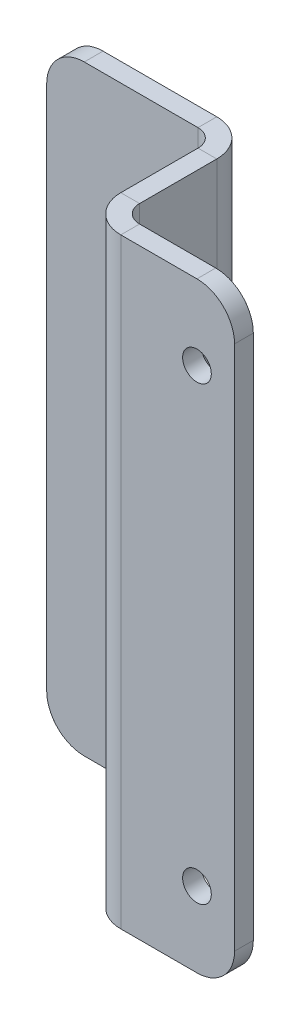
ISO-10303-21;
HEADER;
FILE_DESCRIPTION(('STEP AP214'),'2;1');
FILE_NAME('part.step','',(''),(''),'','','');
FILE_SCHEMA(('AUTOMOTIVE_DESIGN { 1 0 10303 214 1 1 1 1 }'));
ENDSEC;
DATA;
#1=APPLICATION_CONTEXT('core data for automotive mechanical design processes');
#2=APPLICATION_PROTOCOL_DEFINITION('international standard','automotive_design',2000,#1);
#3=PRODUCT_CONTEXT('',#1,'mechanical');
#4=PRODUCT('Part','Part','',(#3));
#5=PRODUCT_RELATED_PRODUCT_CATEGORY('part','',(#4));
#6=PRODUCT_DEFINITION_FORMATION('','',#4);
#7=PRODUCT_DEFINITION_CONTEXT('part definition',#1,'design');
#8=PRODUCT_DEFINITION('design','',#6,#7);
#9=PRODUCT_DEFINITION_SHAPE('','',#8);
#10=(LENGTH_UNIT() NAMED_UNIT(*) SI_UNIT(.MILLI.,.METRE.));
#11=(NAMED_UNIT(*) PLANE_ANGLE_UNIT() SI_UNIT($,.RADIAN.));
#12=(NAMED_UNIT(*) SI_UNIT($,.STERADIAN.) SOLID_ANGLE_UNIT());
#13=UNCERTAINTY_MEASURE_WITH_UNIT(LENGTH_MEASURE(1.E-05),#10,'distance_accuracy_value','');
#14=(GEOMETRIC_REPRESENTATION_CONTEXT(3) GLOBAL_UNCERTAINTY_ASSIGNED_CONTEXT((#13)) GLOBAL_UNIT_ASSIGNED_CONTEXT((#10,
#11,#12)) REPRESENTATION_CONTEXT('',''));
#15=CARTESIAN_POINT('',(0.,0.,0.));
#16=DIRECTION('',(0.,0.,1.));
#17=DIRECTION('',(1.,0.,0.));
#18=AXIS2_PLACEMENT_3D('',#15,#16,#17);
#19=CARTESIAN_POINT('',(-25.4000000000001,0.,-22.225));
#20=DIRECTION('',(0.,-1.,0.));
#21=DIRECTION('',(0.,0.,-1.));
#22=AXIS2_PLACEMENT_3D('',#19,#20,#21);
#23=PLANE('',#22);
#24=DIRECTION('',(1.,0.,0.));
#25=VECTOR('',#24,1.);
#26=CARTESIAN_POINT('',(-25.4000000000001,0.,-19.225));
#27=LINE('',#26,#25);
#28=CARTESIAN_POINT('',(-25.4000000000001,0.,-19.225));
#29=VERTEX_POINT('',#28);
#30=CARTESIAN_POINT('',(-22.2250000000001,0.,-19.225));
#31=VERTEX_POINT('',#30);
#32=EDGE_CURVE('E231',#29,#31,#27,.T.);
#33=ORIENTED_EDGE('',*,*,#32,.F.);
#34=DIRECTION('',(0.,0.,-1.));
#35=VECTOR('',#34,1.);
#36=CARTESIAN_POINT('',(-25.4,0.,0.));
#37=LINE('',#36,#35);
#38=CARTESIAN_POINT('',(-25.4,0.,-6.17499999999998));
#39=VERTEX_POINT('',#38);
#40=EDGE_CURVE('E239',#39,#29,#37,.T.);
#41=ORIENTED_EDGE('',*,*,#40,.F.);
#42=DIRECTION('',(1.,0.,0.));
#43=VECTOR('',#42,1.);
#44=CARTESIAN_POINT('',(-22.225,0.,-6.17499999999999));
#45=LINE('',#44,#43);
#46=CARTESIAN_POINT('',(-22.225,0.,-6.17499999999999));
#47=VERTEX_POINT('',#46);
#48=EDGE_CURVE('E250',#47,#39,#45,.F.);
#49=ORIENTED_EDGE('',*,*,#48,.F.);
#50=DIRECTION('',(0.,0.,1.));
#51=VECTOR('',#50,1.);
#52=CARTESIAN_POINT('',(-22.2250000000001,0.,-22.225));
#53=LINE('',#52,#51);
#54=EDGE_CURVE('E244',#47,#31,#53,.F.);
#55=ORIENTED_EDGE('',*,*,#54,.T.);
#56=EDGE_LOOP('',(#33,#41,#49,#55));
#57=FACE_BOUND('',#56,.T.);
#58=ADVANCED_FACE('F58',(#57),#23,.F.);
#59=CARTESIAN_POINT('',(-25.4,-101.6,-3.17499999999999));
#60=DIRECTION('',(0.,1.,0.));
#61=DIRECTION('',(-1.,0.,0.));
#62=AXIS2_PLACEMENT_3D('',#59,#60,#61);
#63=PLANE('',#62);
#64=DIRECTION('',(1.,0.,0.));
#65=VECTOR('',#64,1.);
#66=CARTESIAN_POINT('',(-25.4000000000001,-101.6,-19.225));
#67=LINE('',#66,#65);
#68=CARTESIAN_POINT('',(-25.4000000000001,-101.6,-19.225));
#69=VERTEX_POINT('',#68);
#70=CARTESIAN_POINT('',(-22.2250000000001,-101.6,-19.225));
#71=VERTEX_POINT('',#70);
#72=EDGE_CURVE('E224',#69,#71,#67,.T.);
#73=ORIENTED_EDGE('',*,*,#72,.T.);
#74=DIRECTION('',(0.,0.,-1.));
#75=VECTOR('',#74,1.);
#76=CARTESIAN_POINT('',(-22.225,-101.6,-3.175));
#77=LINE('',#76,#75);
#78=CARTESIAN_POINT('',(-22.225,-101.6,-6.17499999999999));
#79=VERTEX_POINT('',#78);
#80=EDGE_CURVE('E242',#71,#79,#77,.F.);
#81=ORIENTED_EDGE('',*,*,#80,.T.);
#82=DIRECTION('',(1.,0.,0.));
#83=VECTOR('',#82,1.);
#84=CARTESIAN_POINT('',(-25.4,-101.6,-6.17499999999998));
#85=LINE('',#84,#83);
#86=CARTESIAN_POINT('',(-25.4,-101.6,-6.17499999999998));
#87=VERTEX_POINT('',#86);
#88=EDGE_CURVE('E234',#79,#87,#85,.F.);
#89=ORIENTED_EDGE('',*,*,#88,.T.);
#90=DIRECTION('',(0.,0.,1.));
#91=VECTOR('',#90,1.);
#92=CARTESIAN_POINT('',(-25.4,-101.6,0.));
#93=LINE('',#92,#91);
#94=EDGE_CURVE('E236',#69,#87,#93,.T.);
#95=ORIENTED_EDGE('',*,*,#94,.F.);
#96=EDGE_LOOP('',(#73,#81,#89,#95));
#97=FACE_BOUND('',#96,.T.);
#98=ADVANCED_FACE('F370',(#97),#63,.F.);
#99=CARTESIAN_POINT('',(-25.4,0.,0.));
#100=DIRECTION('',(1.,0.,0.));
#101=DIRECTION('',(0.,0.,-1.));
#102=AXIS2_PLACEMENT_3D('',#99,#100,#101);
#103=PLANE('',#102);
#104=DIRECTION('',(0.,-1.,0.));
#105=VECTOR('',#104,1.);
#106=CARTESIAN_POINT('',(-25.4000000000001,-101.6,-19.225));
#107=LINE('',#106,#105);
#108=EDGE_CURVE('E228',#69,#29,#107,.F.);
#109=ORIENTED_EDGE('',*,*,#108,.F.);
#110=ORIENTED_EDGE('',*,*,#94,.T.);
#111=DIRECTION('',(0.,1.,0.));
#112=VECTOR('',#111,1.);
#113=CARTESIAN_POINT('',(-25.4,-101.6,-6.17499999999998));
#114=LINE('',#113,#112);
#115=EDGE_CURVE('E247',#39,#87,#114,.F.);
#116=ORIENTED_EDGE('',*,*,#115,.F.);
#117=ORIENTED_EDGE('',*,*,#40,.T.);
#118=EDGE_LOOP('',(#109,#110,#116,#117));
#119=FACE_BOUND('',#118,.T.);
#120=ADVANCED_FACE('F357',(#119),#103,.F.);
#121=CARTESIAN_POINT('',(-22.225,0.,0.));
#122=DIRECTION('',(1.,0.,0.));
#123=DIRECTION('',(0.,0.,-1.));
#124=AXIS2_PLACEMENT_3D('',#121,#122,#123);
#125=PLANE('',#124);
#126=ORIENTED_EDGE('',*,*,#80,.F.);
#127=DIRECTION('',(0.,-1.,0.));
#128=VECTOR('',#127,1.);
#129=CARTESIAN_POINT('',(-22.2250000000001,-101.6,-19.225));
#130=LINE('',#129,#128);
#131=EDGE_CURVE('E192',#71,#31,#130,.F.);
#132=ORIENTED_EDGE('',*,*,#131,.T.);
#133=ORIENTED_EDGE('',*,*,#54,.F.);
#134=DIRECTION('',(0.,1.,0.));
#135=VECTOR('',#134,1.);
#136=CARTESIAN_POINT('',(-22.225,-101.6,-6.17499999999999));
#137=LINE('',#136,#135);
#138=EDGE_CURVE('E253',#79,#47,#137,.T.);
#139=ORIENTED_EDGE('',*,*,#138,.F.);
#140=EDGE_LOOP('',(#126,#132,#133,#139));
#141=FACE_BOUND('',#140,.T.);
#142=ADVANCED_FACE('F366',(#141),#125,.T.);
#143=CARTESIAN_POINT('',(0.,0.,-3.175));
#144=DIRECTION('',(0.,1.,0.));
#145=DIRECTION('',(-1.,0.,0.));
#146=AXIS2_PLACEMENT_3D('',#143,#144,#145);
#147=PLANE('',#146);
#148=DIRECTION('',(-1.,0.,0.));
#149=VECTOR('',#148,1.);
#150=CARTESIAN_POINT('',(0.,0.,0.));
#151=LINE('',#150,#149);
#152=CARTESIAN_POINT('',(-6.35,0.,0.));
#153=VERTEX_POINT('',#152);
#154=CARTESIAN_POINT('',(-19.225,0.,0.));
#155=VERTEX_POINT('',#154);
#156=EDGE_CURVE('E291',#153,#155,#151,.T.);
#157=ORIENTED_EDGE('',*,*,#156,.F.);
#158=DIRECTION('',(0.,0.,1.));
#159=VECTOR('',#158,1.);
#160=CARTESIAN_POINT('',(-6.35,0.,-3.175));
#161=LINE('',#160,#159);
#162=CARTESIAN_POINT('',(-6.35,0.,-3.175));
#163=VERTEX_POINT('',#162);
#164=EDGE_CURVE('E13',#153,#163,#161,.F.);
#165=ORIENTED_EDGE('',*,*,#164,.T.);
#166=DIRECTION('',(-1.,0.,0.));
#167=VECTOR('',#166,1.);
#168=CARTESIAN_POINT('',(0.,0.,-3.175));
#169=LINE('',#168,#167);
#170=CARTESIAN_POINT('',(-19.225,0.,-3.175));
#171=VERTEX_POINT('',#170);
#172=EDGE_CURVE('E282',#163,#171,#169,.T.);
#173=ORIENTED_EDGE('',*,*,#172,.T.);
#174=DIRECTION('',(0.,0.,1.));
#175=VECTOR('',#174,1.);
#176=CARTESIAN_POINT('',(-19.225,0.,-3.17500000000001));
#177=LINE('',#176,#175);
#178=EDGE_CURVE('E263',#171,#155,#177,.T.);
#179=ORIENTED_EDGE('',*,*,#178,.T.);
#180=EDGE_LOOP('',(#157,#165,#173,#179));
#181=FACE_BOUND('',#180,.T.);
#182=ADVANCED_FACE('F341',(#181),#147,.T.);
#183=CARTESIAN_POINT('',(0.,0.,-3.175));
#184=DIRECTION('',(0.,0.,-1.));
#185=DIRECTION('',(-1.,0.,0.));
#186=AXIS2_PLACEMENT_3D('',#183,#184,#185);
#187=PLANE('',#186);
#188=CARTESIAN_POINT('',(-6.34999999999998,-12.7,-3.175));
#189=DIRECTION('',(0.,0.,-1.));
#190=DIRECTION('',(-1.,0.,0.));
#191=AXIS2_PLACEMENT_3D('',#188,#189,#190);
#192=CIRCLE('',#191,2.4257);
#193=CARTESIAN_POINT('',(-8.77569999999998,-12.7,-3.175));
#194=VERTEX_POINT('',#193);
#195=EDGE_CURVE('E437',#194,#194,#192,.T.);
#196=ORIENTED_EDGE('',*,*,#195,.F.);
#197=EDGE_LOOP('',(#196));
#198=FACE_BOUND('',#197,.T.);
#199=CARTESIAN_POINT('',(-6.34999999999999,-88.9,-3.175));
#200=DIRECTION('',(0.,0.,-1.));
#201=DIRECTION('',(-1.,0.,0.));
#202=AXIS2_PLACEMENT_3D('',#199,#200,#201);
#203=CIRCLE('',#202,2.4257);
#204=CARTESIAN_POINT('',(-8.77569999999998,-88.9,-3.175));
#205=VERTEX_POINT('',#204);
#206=EDGE_CURVE('E448',#205,#205,#203,.T.);
#207=ORIENTED_EDGE('',*,*,#206,.F.);
#208=EDGE_LOOP('',(#207));
#209=FACE_BOUND('',#208,.T.);
#210=DIRECTION('',(0.,1.,0.));
#211=VECTOR('',#210,1.);
#212=CARTESIAN_POINT('',(0.,0.,-3.175));
#213=LINE('',#212,#211);
#214=CARTESIAN_POINT('',(0.,-95.25,-3.175));
#215=VERTEX_POINT('',#214);
#216=CARTESIAN_POINT('',(0.,-6.35,-3.175));
#217=VERTEX_POINT('',#216);
#218=EDGE_CURVE('E280',#215,#217,#213,.T.);
#219=ORIENTED_EDGE('',*,*,#218,.F.);
#220=CARTESIAN_POINT('',(-6.34999999999999,-95.25,-3.175));
#221=DIRECTION('',(0.,0.,-1.));
#222=DIRECTION('',(-1.,0.,0.));
#223=AXIS2_PLACEMENT_3D('',#220,#221,#222);
#224=CIRCLE('',#223,6.35);
#225=CARTESIAN_POINT('',(-6.34999999999999,-101.6,-3.175));
#226=VERTEX_POINT('',#225);
#227=EDGE_CURVE('E66',#215,#226,#224,.T.);
#228=ORIENTED_EDGE('',*,*,#227,.T.);
#229=DIRECTION('',(1.,0.,0.));
#230=VECTOR('',#229,1.);
#231=CARTESIAN_POINT('',(0.,-101.6,-3.175));
#232=LINE('',#231,#230);
#233=CARTESIAN_POINT('',(-19.225,-101.6,-3.175));
#234=VERTEX_POINT('',#233);
#235=EDGE_CURVE('E285',#234,#226,#232,.T.);
#236=ORIENTED_EDGE('',*,*,#235,.F.);
#237=DIRECTION('',(0.,1.,0.));
#238=VECTOR('',#237,1.);
#239=CARTESIAN_POINT('',(-19.225,0.,-3.17500000000001));
#240=LINE('',#239,#238);
#241=EDGE_CURVE('E269',#171,#234,#240,.F.);
#242=ORIENTED_EDGE('',*,*,#241,.F.);
#243=ORIENTED_EDGE('',*,*,#172,.F.);
#244=CARTESIAN_POINT('',(-6.35,-6.35,-3.175));
#245=DIRECTION('',(0.,0.,-1.));
#246=DIRECTION('',(-1.,0.,0.));
#247=AXIS2_PLACEMENT_3D('',#244,#245,#246);
#248=CIRCLE('',#247,6.35);
#249=EDGE_CURVE('E78',#163,#217,#248,.T.);
#250=ORIENTED_EDGE('',*,*,#249,.T.);
#251=EDGE_LOOP('',(#219,#228,#236,#242,#243,#250));
#252=FACE_BOUND('',#251,.T.);
#253=ADVANCED_FACE('F325',(#198,#209,#252),#187,.T.);
#254=CARTESIAN_POINT('',(0.,0.,0.));
#255=DIRECTION('',(0.,0.,-1.));
#256=DIRECTION('',(-1.,0.,0.));
#257=AXIS2_PLACEMENT_3D('',#254,#255,#256);
#258=PLANE('',#257);
#259=CARTESIAN_POINT('',(-6.34999999999998,-12.7,0.));
#260=DIRECTION('',(0.,0.,1.));
#261=DIRECTION('',(1.,0.,0.));
#262=AXIS2_PLACEMENT_3D('',#259,#260,#261);
#263=CIRCLE('',#262,2.4257);
#264=CARTESIAN_POINT('',(-3.92429999999998,-12.7,0.));
#265=VERTEX_POINT('',#264);
#266=EDGE_CURVE('E440',#265,#265,#263,.T.);
#267=ORIENTED_EDGE('',*,*,#266,.F.);
#268=EDGE_LOOP('',(#267));
#269=FACE_BOUND('',#268,.T.);
#270=CARTESIAN_POINT('',(-6.34999999999999,-88.9,0.));
#271=DIRECTION('',(0.,0.,1.));
#272=DIRECTION('',(1.,0.,0.));
#273=AXIS2_PLACEMENT_3D('',#270,#271,#272);
#274=CIRCLE('',#273,2.4257);
#275=CARTESIAN_POINT('',(-3.92429999999999,-88.9,0.));
#276=VERTEX_POINT('',#275);
#277=EDGE_CURVE('E443',#276,#276,#274,.T.);
#278=ORIENTED_EDGE('',*,*,#277,.F.);
#279=EDGE_LOOP('',(#278));
#280=FACE_BOUND('',#279,.T.);
#281=DIRECTION('',(1.,0.,0.));
#282=VECTOR('',#281,1.);
#283=CARTESIAN_POINT('',(0.,-101.6,0.));
#284=LINE('',#283,#282);
#285=CARTESIAN_POINT('',(-19.225,-101.6,0.));
#286=VERTEX_POINT('',#285);
#287=CARTESIAN_POINT('',(-6.34999999999999,-101.6,0.));
#288=VERTEX_POINT('',#287);
#289=EDGE_CURVE('E283',#286,#288,#284,.T.);
#290=ORIENTED_EDGE('',*,*,#289,.T.);
#291=CARTESIAN_POINT('',(-6.34999999999999,-95.25,0.));
#292=DIRECTION('',(0.,0.,-1.));
#293=DIRECTION('',(-1.,0.,0.));
#294=AXIS2_PLACEMENT_3D('',#291,#292,#293);
#295=CIRCLE('',#294,6.35);
#296=CARTESIAN_POINT('',(0.,-95.25,0.));
#297=VERTEX_POINT('',#296);
#298=EDGE_CURVE('E316',#288,#297,#295,.F.);
#299=ORIENTED_EDGE('',*,*,#298,.T.);
#300=DIRECTION('',(0.,1.,0.));
#301=VECTOR('',#300,1.);
#302=CARTESIAN_POINT('',(0.,0.,0.));
#303=LINE('',#302,#301);
#304=CARTESIAN_POINT('',(0.,-6.35,0.));
#305=VERTEX_POINT('',#304);
#306=EDGE_CURVE('E277',#297,#305,#303,.T.);
#307=ORIENTED_EDGE('',*,*,#306,.T.);
#308=CARTESIAN_POINT('',(-6.35,-6.35,0.));
#309=DIRECTION('',(0.,0.,-1.));
#310=DIRECTION('',(-1.,0.,0.));
#311=AXIS2_PLACEMENT_3D('',#308,#309,#310);
#312=CIRCLE('',#311,6.35);
#313=EDGE_CURVE('E314',#305,#153,#312,.F.);
#314=ORIENTED_EDGE('',*,*,#313,.T.);
#315=ORIENTED_EDGE('',*,*,#156,.T.);
#316=DIRECTION('',(0.,1.,0.));
#317=VECTOR('',#316,1.);
#318=CARTESIAN_POINT('',(-19.225,0.,0.));
#319=LINE('',#318,#317);
#320=EDGE_CURVE('E257',#155,#286,#319,.F.);
#321=ORIENTED_EDGE('',*,*,#320,.T.);
#322=EDGE_LOOP('',(#290,#299,#307,#314,#315,#321));
#323=FACE_BOUND('',#322,.T.);
#324=ADVANCED_FACE('F336',(#269,#280,#323),#258,.F.);
#325=CARTESIAN_POINT('',(0.,0.,-3.175));
#326=DIRECTION('',(1.,0.,0.));
#327=DIRECTION('',(0.,1.,0.));
#328=AXIS2_PLACEMENT_3D('',#325,#326,#327);
#329=PLANE('',#328);
#330=ORIENTED_EDGE('',*,*,#306,.F.);
#331=DIRECTION('',(0.,0.,1.));
#332=VECTOR('',#331,1.);
#333=CARTESIAN_POINT('',(0.,-95.25,-3.175));
#334=LINE('',#333,#332);
#335=EDGE_CURVE('E321',#297,#215,#334,.F.);
#336=ORIENTED_EDGE('',*,*,#335,.T.);
#337=ORIENTED_EDGE('',*,*,#218,.T.);
#338=DIRECTION('',(0.,0.,1.));
#339=VECTOR('',#338,1.);
#340=CARTESIAN_POINT('',(0.,-6.35,-3.175));
#341=LINE('',#340,#339);
#342=EDGE_CURVE('E318',#217,#305,#341,.T.);
#343=ORIENTED_EDGE('',*,*,#342,.T.);
#344=EDGE_LOOP('',(#330,#336,#337,#343));
#345=FACE_BOUND('',#344,.T.);
#346=ADVANCED_FACE('F338',(#345),#329,.T.);
#347=CARTESIAN_POINT('',(0.,-101.6,-3.175));
#348=DIRECTION('',(0.,-1.,0.));
#349=DIRECTION('',(0.,0.,-1.));
#350=AXIS2_PLACEMENT_3D('',#347,#348,#349);
#351=PLANE('',#350);
#352=ORIENTED_EDGE('',*,*,#235,.T.);
#353=DIRECTION('',(0.,0.,1.));
#354=VECTOR('',#353,1.);
#355=CARTESIAN_POINT('',(-6.34999999999999,-101.6,-3.175));
#356=LINE('',#355,#354);
#357=EDGE_CURVE('E311',#226,#288,#356,.T.);
#358=ORIENTED_EDGE('',*,*,#357,.T.);
#359=ORIENTED_EDGE('',*,*,#289,.F.);
#360=DIRECTION('',(0.,0.,1.));
#361=VECTOR('',#360,1.);
#362=CARTESIAN_POINT('',(-19.225,-101.6,-3.17500000000001));
#363=LINE('',#362,#361);
#364=EDGE_CURVE('E274',#234,#286,#363,.T.);
#365=ORIENTED_EDGE('',*,*,#364,.F.);
#366=EDGE_LOOP('',(#352,#358,#359,#365));
#367=FACE_BOUND('',#366,.T.);
#368=ADVANCED_FACE('F331',(#367),#351,.T.);
#369=CARTESIAN_POINT('',(-19.225,-101.6,-6.175));
#370=DIRECTION('',(0.,-1.,0.));
#371=DIRECTION('',(0.,0.,-1.));
#372=AXIS2_PLACEMENT_3D('',#369,#370,#371);
#373=PLANE('',#372);
#374=ORIENTED_EDGE('',*,*,#88,.F.);
#375=CARTESIAN_POINT('',(-19.225,-101.6,-6.175));
#376=DIRECTION('',(0.,1.,0.));
#377=DIRECTION('',(0.,0.,1.));
#378=AXIS2_PLACEMENT_3D('',#375,#376,#377);
#379=CIRCLE('',#378,2.99999999999999);
#380=EDGE_CURVE('E266',#234,#79,#379,.F.);
#381=ORIENTED_EDGE('',*,*,#380,.F.);
#382=ORIENTED_EDGE('',*,*,#364,.T.);
#383=CARTESIAN_POINT('',(-19.225,-101.6,-6.175));
#384=DIRECTION('',(0.,1.,0.));
#385=DIRECTION('',(0.,0.,1.));
#386=AXIS2_PLACEMENT_3D('',#383,#384,#385);
#387=CIRCLE('',#386,6.17499999999999);
#388=EDGE_CURVE('E259',#286,#87,#387,.F.);
#389=ORIENTED_EDGE('',*,*,#388,.T.);
#390=EDGE_LOOP('',(#374,#381,#382,#389));
#391=FACE_BOUND('',#390,.T.);
#392=ADVANCED_FACE('F373',(#391),#373,.T.);
#393=CARTESIAN_POINT('',(-19.225,0.,-6.175));
#394=DIRECTION('',(0.,-1.,0.));
#395=DIRECTION('',(0.,0.,-1.));
#396=AXIS2_PLACEMENT_3D('',#393,#394,#395);
#397=PLANE('',#396);
#398=CARTESIAN_POINT('',(-19.225,0.,-6.175));
#399=DIRECTION('',(0.,1.,0.));
#400=DIRECTION('',(0.,0.,1.));
#401=AXIS2_PLACEMENT_3D('',#398,#399,#400);
#402=CIRCLE('',#401,2.99999999999999);
#403=EDGE_CURVE('E238',#47,#171,#402,.T.);
#404=ORIENTED_EDGE('',*,*,#403,.F.);
#405=ORIENTED_EDGE('',*,*,#48,.T.);
#406=CARTESIAN_POINT('',(-19.225,0.,-6.175));
#407=DIRECTION('',(0.,1.,0.));
#408=DIRECTION('',(0.,0.,1.));
#409=AXIS2_PLACEMENT_3D('',#406,#407,#408);
#410=CIRCLE('',#409,6.17499999999999);
#411=EDGE_CURVE('E260',#39,#155,#410,.T.);
#412=ORIENTED_EDGE('',*,*,#411,.T.);
#413=ORIENTED_EDGE('',*,*,#178,.F.);
#414=EDGE_LOOP('',(#404,#405,#412,#413));
#415=FACE_BOUND('',#414,.T.);
#416=ADVANCED_FACE('F349',(#415),#397,.F.);
#417=CARTESIAN_POINT('',(-19.225,0.,-6.175));
#418=DIRECTION('',(0.,1.,0.));
#419=DIRECTION('',(-1.,0.,0.));
#420=AXIS2_PLACEMENT_3D('',#417,#418,#419);
#421=CYLINDRICAL_SURFACE('',#420,6.17499999999999);
#422=ORIENTED_EDGE('',*,*,#320,.F.);
#423=ORIENTED_EDGE('',*,*,#411,.F.);
#424=ORIENTED_EDGE('',*,*,#115,.T.);
#425=ORIENTED_EDGE('',*,*,#388,.F.);
#426=EDGE_LOOP('',(#422,#423,#424,#425));
#427=FACE_BOUND('',#426,.T.);
#428=ADVANCED_FACE('F348',(#427),#421,.T.);
#429=CARTESIAN_POINT('',(-19.225,0.,-6.175));
#430=DIRECTION('',(0.,1.,0.));
#431=DIRECTION('',(-1.,0.,0.));
#432=AXIS2_PLACEMENT_3D('',#429,#430,#431);
#433=CYLINDRICAL_SURFACE('',#432,2.99999999999999);
#434=ORIENTED_EDGE('',*,*,#241,.T.);
#435=ORIENTED_EDGE('',*,*,#380,.T.);
#436=ORIENTED_EDGE('',*,*,#138,.T.);
#437=ORIENTED_EDGE('',*,*,#403,.T.);
#438=EDGE_LOOP('',(#434,#435,#436,#437));
#439=FACE_BOUND('',#438,.T.);
#440=ADVANCED_FACE('F375',(#439),#433,.F.);
#441=CARTESIAN_POINT('',(-28.4,0.,-19.225));
#442=DIRECTION('',(0.,1.,0.));
#443=DIRECTION('',(0.,0.,1.));
#444=AXIS2_PLACEMENT_3D('',#441,#442,#443);
#445=PLANE('',#444);
#446=DIRECTION('',(0.,0.,-1.));
#447=VECTOR('',#446,1.);
#448=CARTESIAN_POINT('',(-28.4000000000001,0.,-22.225));
#449=LINE('',#448,#447);
#450=CARTESIAN_POINT('',(-28.4,0.,-22.225));
#451=VERTEX_POINT('',#450);
#452=CARTESIAN_POINT('',(-28.4,0.,-25.4));
#453=VERTEX_POINT('',#452);
#454=EDGE_CURVE('E214',#451,#453,#449,.T.);
#455=ORIENTED_EDGE('',*,*,#454,.F.);
#456=CARTESIAN_POINT('',(-28.4,0.,-19.225));
#457=DIRECTION('',(0.,-1.,0.));
#458=DIRECTION('',(0.,0.,-1.));
#459=AXIS2_PLACEMENT_3D('',#456,#457,#458);
#460=CIRCLE('',#459,3.);
#461=EDGE_CURVE('E195',#29,#451,#460,.F.);
#462=ORIENTED_EDGE('',*,*,#461,.F.);
#463=ORIENTED_EDGE('',*,*,#32,.T.);
#464=CARTESIAN_POINT('',(-28.4,0.,-19.225));
#465=DIRECTION('',(0.,-1.,0.));
#466=DIRECTION('',(0.,0.,-1.));
#467=AXIS2_PLACEMENT_3D('',#464,#465,#466);
#468=CIRCLE('',#467,6.175);
#469=EDGE_CURVE('E223',#31,#453,#468,.F.);
#470=ORIENTED_EDGE('',*,*,#469,.T.);
#471=EDGE_LOOP('',(#455,#462,#463,#470));
#472=FACE_BOUND('',#471,.T.);
#473=ADVANCED_FACE('F362',(#472),#445,.T.);
#474=CARTESIAN_POINT('',(-28.4,-101.6,-19.225));
#475=DIRECTION('',(0.,1.,0.));
#476=DIRECTION('',(0.,0.,1.));
#477=AXIS2_PLACEMENT_3D('',#474,#475,#476);
#478=PLANE('',#477);
#479=CARTESIAN_POINT('',(-28.4,-101.6,-19.225));
#480=DIRECTION('',(0.,-1.,0.));
#481=DIRECTION('',(0.,0.,-1.));
#482=AXIS2_PLACEMENT_3D('',#479,#480,#481);
#483=CIRCLE('',#482,3.);
#484=CARTESIAN_POINT('',(-28.4,-101.6,-22.225));
#485=VERTEX_POINT('',#484);
#486=EDGE_CURVE('E182',#485,#69,#483,.T.);
#487=ORIENTED_EDGE('',*,*,#486,.F.);
#488=DIRECTION('',(0.,0.,-1.));
#489=VECTOR('',#488,1.);
#490=CARTESIAN_POINT('',(-28.4,-101.6,-22.225));
#491=LINE('',#490,#489);
#492=CARTESIAN_POINT('',(-28.4,-101.6,-25.4));
#493=VERTEX_POINT('',#492);
#494=EDGE_CURVE('E176',#485,#493,#491,.T.);
#495=ORIENTED_EDGE('',*,*,#494,.T.);
#496=CARTESIAN_POINT('',(-28.4,-101.6,-19.225));
#497=DIRECTION('',(0.,-1.,0.));
#498=DIRECTION('',(0.,0.,-1.));
#499=AXIS2_PLACEMENT_3D('',#496,#497,#498);
#500=CIRCLE('',#499,6.175);
#501=EDGE_CURVE('E187',#493,#71,#500,.T.);
#502=ORIENTED_EDGE('',*,*,#501,.T.);
#503=ORIENTED_EDGE('',*,*,#72,.F.);
#504=EDGE_LOOP('',(#487,#495,#502,#503));
#505=FACE_BOUND('',#504,.T.);
#506=ADVANCED_FACE('F198',(#505),#478,.F.);
#507=CARTESIAN_POINT('',(-28.4,-101.6,-19.225));
#508=DIRECTION('',(0.,-1.,0.));
#509=DIRECTION('',(0.,0.,-1.));
#510=AXIS2_PLACEMENT_3D('',#507,#508,#509);
#511=CYLINDRICAL_SURFACE('',#510,6.175);
#512=ORIENTED_EDGE('',*,*,#131,.F.);
#513=ORIENTED_EDGE('',*,*,#501,.F.);
#514=DIRECTION('',(0.,-1.,0.));
#515=VECTOR('',#514,1.);
#516=CARTESIAN_POINT('',(-28.4000000000001,0.,-25.4));
#517=LINE('',#516,#515);
#518=EDGE_CURVE('E189',#453,#493,#517,.T.);
#519=ORIENTED_EDGE('',*,*,#518,.F.);
#520=ORIENTED_EDGE('',*,*,#469,.F.);
#521=EDGE_LOOP('',(#512,#513,#519,#520));
#522=FACE_BOUND('',#521,.T.);
#523=ADVANCED_FACE('F188',(#522),#511,.T.);
#524=CARTESIAN_POINT('',(-28.4,-101.6,-19.225));
#525=DIRECTION('',(0.,-1.,0.));
#526=DIRECTION('',(0.,0.,-1.));
#527=AXIS2_PLACEMENT_3D('',#524,#525,#526);
#528=CYLINDRICAL_SURFACE('',#527,3.);
#529=ORIENTED_EDGE('',*,*,#108,.T.);
#530=ORIENTED_EDGE('',*,*,#461,.T.);
#531=DIRECTION('',(0.,-1.,0.));
#532=VECTOR('',#531,1.);
#533=CARTESIAN_POINT('',(-28.4000000000001,0.,-22.225));
#534=LINE('',#533,#532);
#535=EDGE_CURVE('E200',#451,#485,#534,.T.);
#536=ORIENTED_EDGE('',*,*,#535,.T.);
#537=ORIENTED_EDGE('',*,*,#486,.T.);
#538=EDGE_LOOP('',(#529,#530,#536,#537));
#539=FACE_BOUND('',#538,.T.);
#540=ADVANCED_FACE('F398',(#539),#528,.F.);
#541=CARTESIAN_POINT('',(-25.4000000000001,-101.6,-25.4));
#542=DIRECTION('',(0.,-1.,0.));
#543=DIRECTION('',(0.,0.,-1.));
#544=AXIS2_PLACEMENT_3D('',#541,#542,#543);
#545=PLANE('',#544);
#546=DIRECTION('',(1.,0.,0.));
#547=VECTOR('',#546,1.);
#548=CARTESIAN_POINT('',(-25.4000000000001,-101.6,-22.225));
#549=LINE('',#548,#547);
#550=CARTESIAN_POINT('',(-47.625,-101.6,-22.225));
#551=VERTEX_POINT('',#550);
#552=EDGE_CURVE('E216',#551,#485,#549,.T.);
#553=ORIENTED_EDGE('',*,*,#552,.F.);
#554=DIRECTION('',(0.,0.,1.));
#555=VECTOR('',#554,1.);
#556=CARTESIAN_POINT('',(-47.625,-101.6,-25.4));
#557=LINE('',#556,#555);
#558=CARTESIAN_POINT('',(-47.625,-101.6,-25.4));
#559=VERTEX_POINT('',#558);
#560=EDGE_CURVE('E178',#551,#559,#557,.F.);
#561=ORIENTED_EDGE('',*,*,#560,.T.);
#562=DIRECTION('',(1.,0.,0.));
#563=VECTOR('',#562,1.);
#564=CARTESIAN_POINT('',(-25.4000000000001,-101.6,-25.4));
#565=LINE('',#564,#563);
#566=EDGE_CURVE('E171',#559,#493,#565,.T.);
#567=ORIENTED_EDGE('',*,*,#566,.T.);
#568=ORIENTED_EDGE('',*,*,#494,.F.);
#569=EDGE_LOOP('',(#553,#561,#567,#568));
#570=FACE_BOUND('',#569,.T.);
#571=ADVANCED_FACE('F174',(#570),#545,.T.);
#572=CARTESIAN_POINT('',(-53.9750000000001,0.,-25.4));
#573=DIRECTION('',(0.,1.,0.));
#574=DIRECTION('',(-1.,0.,0.));
#575=AXIS2_PLACEMENT_3D('',#572,#573,#574);
#576=PLANE('',#575);
#577=DIRECTION('',(-1.,0.,0.));
#578=VECTOR('',#577,1.);
#579=CARTESIAN_POINT('',(-53.9750000000001,0.,-25.4));
#580=LINE('',#579,#578);
#581=CARTESIAN_POINT('',(-47.6250000000001,0.,-25.4));
#582=VERTEX_POINT('',#581);
#583=EDGE_CURVE('E206',#453,#582,#580,.T.);
#584=ORIENTED_EDGE('',*,*,#583,.T.);
#585=DIRECTION('',(0.,0.,1.));
#586=VECTOR('',#585,1.);
#587=CARTESIAN_POINT('',(-47.6250000000001,0.,-25.4));
#588=LINE('',#587,#586);
#589=CARTESIAN_POINT('',(-47.6250000000001,0.,-22.225));
#590=VERTEX_POINT('',#589);
#591=EDGE_CURVE('E288',#582,#590,#588,.T.);
#592=ORIENTED_EDGE('',*,*,#591,.T.);
#593=DIRECTION('',(-1.,0.,0.));
#594=VECTOR('',#593,1.);
#595=CARTESIAN_POINT('',(-53.9750000000001,0.,-22.225));
#596=LINE('',#595,#594);
#597=EDGE_CURVE('E207',#451,#590,#596,.T.);
#598=ORIENTED_EDGE('',*,*,#597,.F.);
#599=ORIENTED_EDGE('',*,*,#454,.T.);
#600=EDGE_LOOP('',(#584,#592,#598,#599));
#601=FACE_BOUND('',#600,.T.);
#602=ADVANCED_FACE('F404',(#601),#576,.T.);
#603=CARTESIAN_POINT('',(0.,0.,-25.4));
#604=DIRECTION('',(0.,0.,-1.));
#605=DIRECTION('',(0.,1.,0.));
#606=AXIS2_PLACEMENT_3D('',#603,#604,#605);
#607=PLANE('',#606);
#608=DIRECTION('',(0.,-1.,0.));
#609=VECTOR('',#608,1.);
#610=CARTESIAN_POINT('',(-53.975,-101.6,-25.4));
#611=LINE('',#610,#609);
#612=CARTESIAN_POINT('',(-53.9750000000001,-6.34999999999998,-25.4));
#613=VERTEX_POINT('',#612);
#614=CARTESIAN_POINT('',(-53.975,-95.25,-25.4));
#615=VERTEX_POINT('',#614);
#616=EDGE_CURVE('E183',#613,#615,#611,.T.);
#617=ORIENTED_EDGE('',*,*,#616,.F.);
#618=CARTESIAN_POINT('',(-47.625,-6.34999999999998,-25.4));
#619=DIRECTION('',(0.,0.,-1.));
#620=DIRECTION('',(0.,1.,0.));
#621=AXIS2_PLACEMENT_3D('',#618,#619,#620);
#622=CIRCLE('',#621,6.35);
#623=EDGE_CURVE('E308',#613,#582,#622,.T.);
#624=ORIENTED_EDGE('',*,*,#623,.T.);
#625=ORIENTED_EDGE('',*,*,#583,.F.);
#626=ORIENTED_EDGE('',*,*,#518,.T.);
#627=ORIENTED_EDGE('',*,*,#566,.F.);
#628=CARTESIAN_POINT('',(-47.625,-95.25,-25.4));
#629=DIRECTION('',(0.,0.,-1.));
#630=DIRECTION('',(0.,1.,0.));
#631=AXIS2_PLACEMENT_3D('',#628,#629,#630);
#632=CIRCLE('',#631,6.35);
#633=EDGE_CURVE('E306',#559,#615,#632,.T.);
#634=ORIENTED_EDGE('',*,*,#633,.T.);
#635=EDGE_LOOP('',(#617,#624,#625,#626,#627,#634));
#636=FACE_BOUND('',#635,.T.);
#637=ADVANCED_FACE('F204',(#636),#607,.T.);
#638=CARTESIAN_POINT('',(0.,0.,-22.225));
#639=DIRECTION('',(0.,0.,-1.));
#640=DIRECTION('',(0.,1.,0.));
#641=AXIS2_PLACEMENT_3D('',#638,#639,#640);
#642=PLANE('',#641);
#643=ORIENTED_EDGE('',*,*,#597,.T.);
#644=CARTESIAN_POINT('',(-47.625,-6.34999999999998,-22.225));
#645=DIRECTION('',(0.,0.,-1.));
#646=DIRECTION('',(0.,1.,0.));
#647=AXIS2_PLACEMENT_3D('',#644,#645,#646);
#648=CIRCLE('',#647,6.35);
#649=CARTESIAN_POINT('',(-53.9750000000001,-6.34999999999998,-22.225));
#650=VERTEX_POINT('',#649);
#651=EDGE_CURVE('E299',#590,#650,#648,.F.);
#652=ORIENTED_EDGE('',*,*,#651,.T.);
#653=DIRECTION('',(0.,-1.,0.));
#654=VECTOR('',#653,1.);
#655=CARTESIAN_POINT('',(-53.975,-101.6,-22.225));
#656=LINE('',#655,#654);
#657=CARTESIAN_POINT('',(-53.975,-95.25,-22.225));
#658=VERTEX_POINT('',#657);
#659=EDGE_CURVE('E210',#650,#658,#656,.T.);
#660=ORIENTED_EDGE('',*,*,#659,.T.);
#661=CARTESIAN_POINT('',(-47.625,-95.25,-22.225));
#662=DIRECTION('',(0.,0.,-1.));
#663=DIRECTION('',(0.,1.,0.));
#664=AXIS2_PLACEMENT_3D('',#661,#662,#663);
#665=CIRCLE('',#664,6.35);
#666=EDGE_CURVE('E297',#658,#551,#665,.F.);
#667=ORIENTED_EDGE('',*,*,#666,.T.);
#668=ORIENTED_EDGE('',*,*,#552,.T.);
#669=ORIENTED_EDGE('',*,*,#535,.F.);
#670=EDGE_LOOP('',(#643,#652,#660,#667,#668,#669));
#671=FACE_BOUND('',#670,.T.);
#672=ADVANCED_FACE('F412',(#671),#642,.F.);
#673=CARTESIAN_POINT('',(-53.975,-101.6,-25.4));
#674=DIRECTION('',(-1.,0.,0.));
#675=DIRECTION('',(0.,-1.,0.));
#676=AXIS2_PLACEMENT_3D('',#673,#674,#675);
#677=PLANE('',#676);
#678=ORIENTED_EDGE('',*,*,#659,.F.);
#679=DIRECTION('',(0.,0.,1.));
#680=VECTOR('',#679,1.);
#681=CARTESIAN_POINT('',(-53.9750000000001,-6.34999999999998,-25.4));
#682=LINE('',#681,#680);
#683=EDGE_CURVE('E304',#650,#613,#682,.F.);
#684=ORIENTED_EDGE('',*,*,#683,.T.);
#685=ORIENTED_EDGE('',*,*,#616,.T.);
#686=DIRECTION('',(0.,0.,1.));
#687=VECTOR('',#686,1.);
#688=CARTESIAN_POINT('',(-53.975,-95.25,-25.4));
#689=LINE('',#688,#687);
#690=EDGE_CURVE('E301',#615,#658,#689,.T.);
#691=ORIENTED_EDGE('',*,*,#690,.T.);
#692=EDGE_LOOP('',(#678,#684,#685,#691));
#693=FACE_BOUND('',#692,.T.);
#694=ADVANCED_FACE('F408',(#693),#677,.T.);
#695=CARTESIAN_POINT('',(-6.34999999999999,-88.9,0.));
#696=DIRECTION('',(0.,0.,1.));
#697=DIRECTION('',(1.,0.,0.));
#698=AXIS2_PLACEMENT_3D('',#695,#696,#697);
#699=CYLINDRICAL_SURFACE('',#698,2.4257);
#700=ORIENTED_EDGE('',*,*,#206,.T.);
#701=EDGE_LOOP('',(#700));
#702=FACE_BOUND('',#701,.T.);
#703=ORIENTED_EDGE('',*,*,#277,.T.);
#704=EDGE_LOOP('',(#703));
#705=FACE_BOUND('',#704,.T.);
#706=ADVANCED_FACE('F411',(#702,#705),#699,.F.);
#707=CARTESIAN_POINT('',(-6.34999999999998,-12.7,0.));
#708=DIRECTION('',(0.,0.,1.));
#709=DIRECTION('',(1.,0.,0.));
#710=AXIS2_PLACEMENT_3D('',#707,#708,#709);
#711=CYLINDRICAL_SURFACE('',#710,2.4257);
#712=ORIENTED_EDGE('',*,*,#195,.T.);
#713=EDGE_LOOP('',(#712));
#714=FACE_BOUND('',#713,.T.);
#715=ORIENTED_EDGE('',*,*,#266,.T.);
#716=EDGE_LOOP('',(#715));
#717=FACE_BOUND('',#716,.T.);
#718=ADVANCED_FACE('F423',(#714,#717),#711,.F.);
#719=CARTESIAN_POINT('',(-47.625,-6.34999999999998,-25.4));
#720=DIRECTION('',(0.,0.,1.));
#721=DIRECTION('',(0.,-1.,0.));
#722=AXIS2_PLACEMENT_3D('',#719,#720,#721);
#723=CYLINDRICAL_SURFACE('',#722,6.35);
#724=ORIENTED_EDGE('',*,*,#623,.F.);
#725=ORIENTED_EDGE('',*,*,#683,.F.);
#726=ORIENTED_EDGE('',*,*,#651,.F.);
#727=ORIENTED_EDGE('',*,*,#591,.F.);
#728=EDGE_LOOP('',(#724,#725,#726,#727));
#729=FACE_BOUND('',#728,.T.);
#730=ADVANCED_FACE('F426',(#729),#723,.T.);
#731=CARTESIAN_POINT('',(-47.625,-95.25,-25.4));
#732=DIRECTION('',(0.,0.,1.));
#733=DIRECTION('',(0.,-1.,0.));
#734=AXIS2_PLACEMENT_3D('',#731,#732,#733);
#735=CYLINDRICAL_SURFACE('',#734,6.35);
#736=ORIENTED_EDGE('',*,*,#633,.F.);
#737=ORIENTED_EDGE('',*,*,#560,.F.);
#738=ORIENTED_EDGE('',*,*,#666,.F.);
#739=ORIENTED_EDGE('',*,*,#690,.F.);
#740=EDGE_LOOP('',(#736,#737,#738,#739));
#741=FACE_BOUND('',#740,.T.);
#742=ADVANCED_FACE('F431',(#741),#735,.T.);
#743=CARTESIAN_POINT('',(-6.34999999999999,-95.25,-3.175));
#744=DIRECTION('',(0.,0.,1.));
#745=DIRECTION('',(1.,0.,0.));
#746=AXIS2_PLACEMENT_3D('',#743,#744,#745);
#747=CYLINDRICAL_SURFACE('',#746,6.35);
#748=ORIENTED_EDGE('',*,*,#227,.F.);
#749=ORIENTED_EDGE('',*,*,#335,.F.);
#750=ORIENTED_EDGE('',*,*,#298,.F.);
#751=ORIENTED_EDGE('',*,*,#357,.F.);
#752=EDGE_LOOP('',(#748,#749,#750,#751));
#753=FACE_BOUND('',#752,.T.);
#754=ADVANCED_FACE('F333',(#753),#747,.T.);
#755=CARTESIAN_POINT('',(-6.35,-6.35,-3.175));
#756=DIRECTION('',(0.,0.,1.));
#757=DIRECTION('',(1.,0.,0.));
#758=AXIS2_PLACEMENT_3D('',#755,#756,#757);
#759=CYLINDRICAL_SURFACE('',#758,6.35);
#760=ORIENTED_EDGE('',*,*,#249,.F.);
#761=ORIENTED_EDGE('',*,*,#164,.F.);
#762=ORIENTED_EDGE('',*,*,#313,.F.);
#763=ORIENTED_EDGE('',*,*,#342,.F.);
#764=EDGE_LOOP('',(#760,#761,#762,#763));
#765=FACE_BOUND('',#764,.T.);
#766=ADVANCED_FACE('F60',(#765),#759,.T.);
#767=CLOSED_SHELL('',(#58,#98,#120,#142,#182,#253,#324,#346,#368,#392,#416,#428,#440,#473,#506,
#523,#540,#571,#602,#637,#672,#694,#706,#718,#730,#742,#754,#766));
#768=MANIFOLD_SOLID_BREP('B2',#767);
#769=ADVANCED_BREP_SHAPE_REPRESENTATION('',(#18,#768),#14);
#770=SHAPE_DEFINITION_REPRESENTATION(#9,#769);
ENDSEC;
END-ISO-10303-21;
